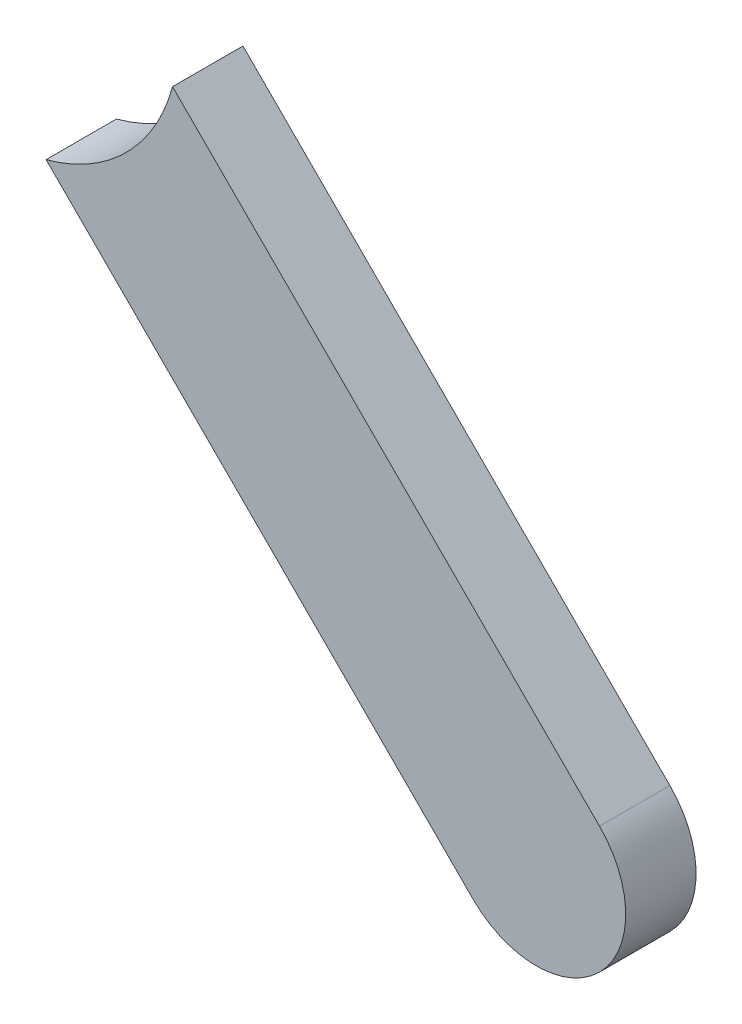
ISO-10303-21;
HEADER;
FILE_DESCRIPTION(('STEP AP214'),'2;1');
FILE_NAME('part.step','',(''),(''),'','','');
FILE_SCHEMA(('AUTOMOTIVE_DESIGN { 1 0 10303 214 1 1 1 1 }'));
ENDSEC;
DATA;
#1=APPLICATION_CONTEXT('core data for automotive mechanical design processes');
#2=APPLICATION_PROTOCOL_DEFINITION('international standard','automotive_design',2000,#1);
#3=PRODUCT_CONTEXT('',#1,'mechanical');
#4=PRODUCT('Part','Part','',(#3));
#5=PRODUCT_RELATED_PRODUCT_CATEGORY('part','',(#4));
#6=PRODUCT_DEFINITION_FORMATION('','',#4);
#7=PRODUCT_DEFINITION_CONTEXT('part definition',#1,'design');
#8=PRODUCT_DEFINITION('design','',#6,#7);
#9=PRODUCT_DEFINITION_SHAPE('','',#8);
#10=(LENGTH_UNIT() NAMED_UNIT(*) SI_UNIT(.MILLI.,.METRE.));
#11=(NAMED_UNIT(*) PLANE_ANGLE_UNIT() SI_UNIT($,.RADIAN.));
#12=(NAMED_UNIT(*) SI_UNIT($,.STERADIAN.) SOLID_ANGLE_UNIT());
#13=UNCERTAINTY_MEASURE_WITH_UNIT(LENGTH_MEASURE(1.E-05),#10,'distance_accuracy_value','');
#14=(GEOMETRIC_REPRESENTATION_CONTEXT(3) GLOBAL_UNCERTAINTY_ASSIGNED_CONTEXT((#13)) GLOBAL_UNIT_ASSIGNED_CONTEXT((#10,
#11,#12)) REPRESENTATION_CONTEXT('',''));
#15=CARTESIAN_POINT('',(0.,0.,0.));
#16=DIRECTION('',(0.,0.,1.));
#17=DIRECTION('',(1.,0.,0.));
#18=AXIS2_PLACEMENT_3D('',#15,#16,#17);
#19=CARTESIAN_POINT('',(94.2384787853028,117.492309334697,0.));
#20=DIRECTION('',(0.707106781186548,0.707106781186548,0.));
#21=DIRECTION('',(0.707106781186548,-0.707106781186548,0.));
#22=AXIS2_PLACEMENT_3D('',#19,#20,#21);
#23=PLANE('',#22);
#24=DIRECTION('',(0.707106781186548,-0.707106781186548,0.));
#25=VECTOR('',#24,1.);
#26=CARTESIAN_POINT('',(93.92739406,117.80339406,0.1999996));
#27=LINE('',#26,#25);
#28=CARTESIAN_POINT('',(94.2384787853028,117.492309334697,0.1999996));
#29=VERTEX_POINT('',#28);
#30=CARTESIAN_POINT('',(95.45139406,116.27939406,0.1999996));
#31=VERTEX_POINT('',#30);
#32=EDGE_CURVE('E11',#29,#31,#27,.T.);
#33=ORIENTED_EDGE('',*,*,#32,.F.);
#34=DIRECTION('',(0.,0.,1.));
#35=VECTOR('',#34,1.);
#36=CARTESIAN_POINT('',(94.2384787853028,117.492309334697,0.));
#37=LINE('',#36,#35);
#38=CARTESIAN_POINT('',(94.2384787853028,117.492309334697,0.));
#39=VERTEX_POINT('',#38);
#40=EDGE_CURVE('E24',#39,#29,#37,.T.);
#41=ORIENTED_EDGE('',*,*,#40,.F.);
#42=DIRECTION('',(0.707106781186548,-0.707106781186548,0.));
#43=VECTOR('',#42,1.);
#44=CARTESIAN_POINT('',(93.92739406,117.80339406,0.));
#45=LINE('',#44,#43);
#46=CARTESIAN_POINT('',(95.45139406,116.27939406,0.));
#47=VERTEX_POINT('',#46);
#48=EDGE_CURVE('E75',#39,#47,#45,.T.);
#49=ORIENTED_EDGE('',*,*,#48,.T.);
#50=DIRECTION('',(0.,0.,1.));
#51=VECTOR('',#50,1.);
#52=CARTESIAN_POINT('',(95.45139406,116.27939406,0.));
#53=LINE('',#52,#51);
#54=EDGE_CURVE('E37',#47,#31,#53,.T.);
#55=ORIENTED_EDGE('',*,*,#54,.T.);
#56=EDGE_LOOP('',(#33,#41,#49,#55));
#57=FACE_BOUND('',#56,.T.);
#58=ADVANCED_FACE('F17',(#57),#23,.F.);
#59=CARTESIAN_POINT('',(95.631,116.459,0.));
#60=DIRECTION('',(0.,0.,-1.));
#61=DIRECTION('',(-0.707106781186548,-0.707106781186548,0.));
#62=AXIS2_PLACEMENT_3D('',#59,#60,#61);
#63=CYLINDRICAL_SURFACE('',#62,0.254001156230764);
#64=CARTESIAN_POINT('',(95.631,116.459,0.1999996));
#65=DIRECTION('',(0.,0.,1.));
#66=DIRECTION('',(-0.707106781186548,-0.707106781186548,0.));
#67=AXIS2_PLACEMENT_3D('',#64,#65,#66);
#68=CIRCLE('',#67,0.254001156230764);
#69=CARTESIAN_POINT('',(95.81060594,116.63860594,0.1999996));
#70=VERTEX_POINT('',#69);
#71=EDGE_CURVE('E83',#31,#70,#68,.T.);
#72=ORIENTED_EDGE('',*,*,#71,.F.);
#73=ORIENTED_EDGE('',*,*,#54,.F.);
#74=CARTESIAN_POINT('',(95.631,116.459,0.));
#75=DIRECTION('',(0.,0.,1.));
#76=DIRECTION('',(-0.707106781186548,-0.707106781186548,0.));
#77=AXIS2_PLACEMENT_3D('',#74,#75,#76);
#78=CIRCLE('',#77,0.254001156230764);
#79=CARTESIAN_POINT('',(95.81060594,116.63860594,0.));
#80=VERTEX_POINT('',#79);
#81=EDGE_CURVE('E81',#47,#80,#78,.T.);
#82=ORIENTED_EDGE('',*,*,#81,.T.);
#83=DIRECTION('',(0.,0.,1.));
#84=VECTOR('',#83,1.);
#85=CARTESIAN_POINT('',(95.81060594,116.63860594,0.));
#86=LINE('',#85,#84);
#87=EDGE_CURVE('E67',#80,#70,#86,.T.);
#88=ORIENTED_EDGE('',*,*,#87,.T.);
#89=EDGE_LOOP('',(#72,#73,#82,#88));
#90=FACE_BOUND('',#89,.T.);
#91=ADVANCED_FACE('F89',(#90),#63,.T.);
#92=CARTESIAN_POINT('',(95.81060594,116.63860594,0.));
#93=DIRECTION('',(-0.707106781186548,-0.707106781186548,0.));
#94=DIRECTION('',(-0.707106781186548,0.707106781186548,0.));
#95=AXIS2_PLACEMENT_3D('',#92,#93,#94);
#96=PLANE('',#95);
#97=DIRECTION('',(-0.707106781186548,0.707106781186548,0.));
#98=VECTOR('',#97,1.);
#99=CARTESIAN_POINT('',(95.81060594,116.63860594,0.1999996));
#100=LINE('',#99,#98);
#101=CARTESIAN_POINT('',(94.5976906653028,117.851521214697,0.1999996));
#102=VERTEX_POINT('',#101);
#103=EDGE_CURVE('E71',#70,#102,#100,.T.);
#104=ORIENTED_EDGE('',*,*,#103,.F.);
#105=ORIENTED_EDGE('',*,*,#87,.F.);
#106=DIRECTION('',(-0.707106781186548,0.707106781186548,0.));
#107=VECTOR('',#106,1.);
#108=CARTESIAN_POINT('',(95.81060594,116.63860594,0.));
#109=LINE('',#108,#107);
#110=CARTESIAN_POINT('',(94.5976906653028,117.851521214697,0.));
#111=VERTEX_POINT('',#110);
#112=EDGE_CURVE('E63',#80,#111,#109,.T.);
#113=ORIENTED_EDGE('',*,*,#112,.T.);
#114=DIRECTION('',(0.,0.,1.));
#115=VECTOR('',#114,1.);
#116=CARTESIAN_POINT('',(94.5976906653028,117.851521214697,0.));
#117=LINE('',#116,#115);
#118=EDGE_CURVE('E53',#111,#102,#117,.T.);
#119=ORIENTED_EDGE('',*,*,#118,.T.);
#120=EDGE_LOOP('',(#104,#105,#113,#119));
#121=FACE_BOUND('',#120,.T.);
#122=ADVANCED_FACE('F66',(#121),#96,.F.);
#123=CARTESIAN_POINT('',(94.107,117.983,0.));
#124=DIRECTION('',(0.,0.,-1.));
#125=DIRECTION('',(1.,0.,0.));
#126=AXIS2_PLACEMENT_3D('',#123,#124,#125);
#127=CYLINDRICAL_SURFACE('',#126,0.508);
#128=ORIENTED_EDGE('',*,*,#40,.T.);
#129=CARTESIAN_POINT('',(94.107,117.983,0.1999996));
#130=DIRECTION('',(0.,0.,1.));
#131=DIRECTION('',(1.,0.,0.));
#132=AXIS2_PLACEMENT_3D('',#129,#130,#131);
#133=CIRCLE('',#132,0.508);
#134=EDGE_CURVE('E59',#29,#102,#133,.T.);
#135=ORIENTED_EDGE('',*,*,#134,.T.);
#136=ORIENTED_EDGE('',*,*,#118,.F.);
#137=CARTESIAN_POINT('',(94.107,117.983,0.));
#138=DIRECTION('',(0.,0.,1.));
#139=DIRECTION('',(1.,0.,0.));
#140=AXIS2_PLACEMENT_3D('',#137,#138,#139);
#141=CIRCLE('',#140,0.508);
#142=EDGE_CURVE('E57',#39,#111,#141,.T.);
#143=ORIENTED_EDGE('',*,*,#142,.F.);
#144=EDGE_LOOP('',(#128,#135,#136,#143));
#145=FACE_BOUND('',#144,.T.);
#146=ADVANCED_FACE('F55',(#145),#127,.F.);
#147=CARTESIAN_POINT('',(93.92739406,117.80339406,0.));
#148=DIRECTION('',(0.,0.,-1.));
#149=DIRECTION('',(-1.,0.,0.));
#150=AXIS2_PLACEMENT_3D('',#147,#148,#149);
#151=PLANE('',#150);
#152=ORIENTED_EDGE('',*,*,#48,.F.);
#153=ORIENTED_EDGE('',*,*,#142,.T.);
#154=ORIENTED_EDGE('',*,*,#112,.F.);
#155=ORIENTED_EDGE('',*,*,#81,.F.);
#156=EDGE_LOOP('',(#152,#153,#154,#155));
#157=FACE_BOUND('',#156,.T.);
#158=ADVANCED_FACE('F74',(#157),#151,.T.);
#159=CARTESIAN_POINT('',(93.92739406,117.80339406,0.1999996));
#160=DIRECTION('',(0.,0.,-1.));
#161=DIRECTION('',(-1.,0.,0.));
#162=AXIS2_PLACEMENT_3D('',#159,#160,#161);
#163=PLANE('',#162);
#164=ORIENTED_EDGE('',*,*,#134,.F.);
#165=ORIENTED_EDGE('',*,*,#32,.T.);
#166=ORIENTED_EDGE('',*,*,#71,.T.);
#167=ORIENTED_EDGE('',*,*,#103,.T.);
#168=EDGE_LOOP('',(#164,#165,#166,#167));
#169=FACE_BOUND('',#168,.T.);
#170=ADVANCED_FACE('F91',(#169),#163,.F.);
#171=CLOSED_SHELL('',(#58,#91,#122,#146,#158,#170));
#172=MANIFOLD_SOLID_BREP('B1',#171);
#173=ADVANCED_BREP_SHAPE_REPRESENTATION('',(#18,#172),#14);
#174=SHAPE_DEFINITION_REPRESENTATION(#9,#173);
ENDSEC;
END-ISO-10303-21;
